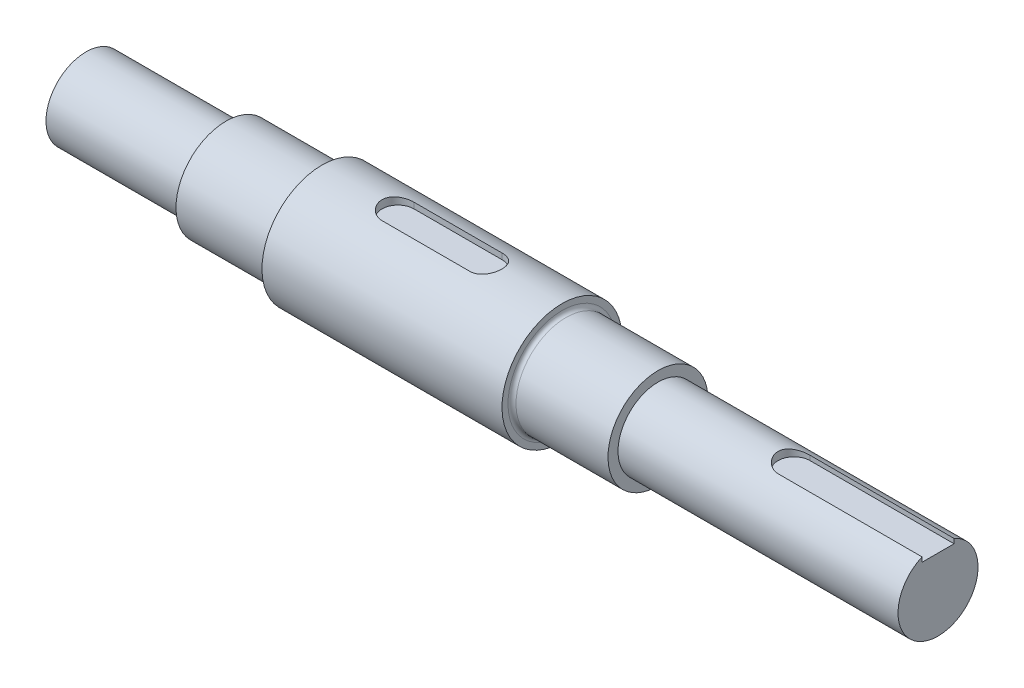
ISO-10303-21;
HEADER;
FILE_DESCRIPTION(('STEP AP214'),'2;1');
FILE_NAME('part.step','',(''),(''),'','','');
FILE_SCHEMA(('AUTOMOTIVE_DESIGN { 1 0 10303 214 1 1 1 1 }'));
ENDSEC;
DATA;
#1=APPLICATION_CONTEXT('core data for automotive mechanical design processes');
#2=APPLICATION_PROTOCOL_DEFINITION('international standard','automotive_design',2000,#1);
#3=PRODUCT_CONTEXT('',#1,'mechanical');
#4=PRODUCT('Part','Part','',(#3));
#5=PRODUCT_RELATED_PRODUCT_CATEGORY('part','',(#4));
#6=PRODUCT_DEFINITION_FORMATION('','',#4);
#7=PRODUCT_DEFINITION_CONTEXT('part definition',#1,'design');
#8=PRODUCT_DEFINITION('design','',#6,#7);
#9=PRODUCT_DEFINITION_SHAPE('','',#8);
#10=(LENGTH_UNIT() NAMED_UNIT(*) SI_UNIT(.MILLI.,.METRE.));
#11=(NAMED_UNIT(*) PLANE_ANGLE_UNIT() SI_UNIT($,.RADIAN.));
#12=(NAMED_UNIT(*) SI_UNIT($,.STERADIAN.) SOLID_ANGLE_UNIT());
#13=UNCERTAINTY_MEASURE_WITH_UNIT(LENGTH_MEASURE(1.E-05),#10,'distance_accuracy_value','');
#14=(GEOMETRIC_REPRESENTATION_CONTEXT(3) GLOBAL_UNCERTAINTY_ASSIGNED_CONTEXT((#13)) GLOBAL_UNIT_ASSIGNED_CONTEXT((#10,
#11,#12)) REPRESENTATION_CONTEXT('',''));
#15=CARTESIAN_POINT('',(0.,0.,0.));
#16=DIRECTION('',(0.,0.,1.));
#17=DIRECTION('',(1.,0.,0.));
#18=AXIS2_PLACEMENT_3D('',#15,#16,#17);
#19=CARTESIAN_POINT('',(-89.,0.,0.));
#20=DIRECTION('',(-1.,0.,0.));
#21=DIRECTION('',(0.,-1.,0.));
#22=AXIS2_PLACEMENT_3D('',#19,#20,#21);
#23=PLANE('',#22);
#24=CARTESIAN_POINT('',(-89.,0.,0.));
#25=DIRECTION('',(1.,0.,0.));
#26=DIRECTION('',(0.,1.,0.));
#27=AXIS2_PLACEMENT_3D('',#24,#25,#26);
#28=CIRCLE('',#27,10.);
#29=CARTESIAN_POINT('',(-89.,10.,0.));
#30=VERTEX_POINT('',#29);
#31=EDGE_CURVE('E184',#30,#30,#28,.T.);
#32=ORIENTED_EDGE('',*,*,#31,.F.);
#33=EDGE_LOOP('',(#32));
#34=FACE_BOUND('',#33,.T.);
#35=ADVANCED_FACE('F38',(#34),#23,.T.);
#36=CARTESIAN_POINT('',(124.,0.,0.));
#37=DIRECTION('',(1.,0.,0.));
#38=DIRECTION('',(0.,1.,0.));
#39=AXIS2_PLACEMENT_3D('',#36,#37,#38);
#40=CYLINDRICAL_SURFACE('',#39,10.);
#41=ORIENTED_EDGE('',*,*,#31,.T.);
#42=EDGE_LOOP('',(#41));
#43=FACE_BOUND('',#42,.T.);
#44=CARTESIAN_POINT('',(-54.,0.,0.));
#45=DIRECTION('',(1.,0.,0.));
#46=DIRECTION('',(0.,1.,0.));
#47=AXIS2_PLACEMENT_3D('',#44,#45,#46);
#48=CIRCLE('',#47,10.);
#49=CARTESIAN_POINT('',(-54.,10.,0.));
#50=VERTEX_POINT('',#49);
#51=EDGE_CURVE('E181',#50,#50,#48,.T.);
#52=ORIENTED_EDGE('',*,*,#51,.F.);
#53=EDGE_LOOP('',(#52));
#54=FACE_BOUND('',#53,.T.);
#55=ADVANCED_FACE('F250',(#43,#54),#40,.T.);
#56=CARTESIAN_POINT('',(-54.,10.,0.));
#57=DIRECTION('',(-1.,0.,0.));
#58=DIRECTION('',(0.,-1.,0.));
#59=AXIS2_PLACEMENT_3D('',#56,#57,#58);
#60=PLANE('',#59);
#61=ORIENTED_EDGE('',*,*,#51,.T.);
#62=EDGE_LOOP('',(#61));
#63=FACE_BOUND('',#62,.T.);
#64=CARTESIAN_POINT('',(-54.,0.,0.));
#65=DIRECTION('',(1.,0.,0.));
#66=DIRECTION('',(0.,1.,0.));
#67=AXIS2_PLACEMENT_3D('',#64,#65,#66);
#68=CIRCLE('',#67,12.5);
#69=CARTESIAN_POINT('',(-54.,12.5,0.));
#70=VERTEX_POINT('',#69);
#71=EDGE_CURVE('E178',#70,#70,#68,.T.);
#72=ORIENTED_EDGE('',*,*,#71,.F.);
#73=EDGE_LOOP('',(#72));
#74=FACE_BOUND('',#73,.T.);
#75=ADVANCED_FACE('F256',(#63,#74),#60,.T.);
#76=CARTESIAN_POINT('',(124.,0.,0.));
#77=DIRECTION('',(1.,0.,0.));
#78=DIRECTION('',(0.,1.,0.));
#79=AXIS2_PLACEMENT_3D('',#76,#77,#78);
#80=CYLINDRICAL_SURFACE('',#79,12.5);
#81=CARTESIAN_POINT('',(-31.,0.,0.));
#82=DIRECTION('',(-1.,0.,0.));
#83=DIRECTION('',(0.,-1.,0.));
#84=AXIS2_PLACEMENT_3D('',#81,#82,#83);
#85=CIRCLE('',#84,12.5);
#86=CARTESIAN_POINT('',(-31.,-12.5,0.));
#87=VERTEX_POINT('',#86);
#88=EDGE_CURVE('E196',#87,#87,#85,.T.);
#89=ORIENTED_EDGE('',*,*,#88,.T.);
#90=EDGE_LOOP('',(#89));
#91=FACE_BOUND('',#90,.T.);
#92=ORIENTED_EDGE('',*,*,#71,.T.);
#93=EDGE_LOOP('',(#92));
#94=FACE_BOUND('',#93,.T.);
#95=ADVANCED_FACE('F306',(#91,#94),#80,.T.);
#96=CARTESIAN_POINT('',(-30.,12.5,0.));
#97=DIRECTION('',(-1.,0.,0.));
#98=DIRECTION('',(0.,-1.,0.));
#99=AXIS2_PLACEMENT_3D('',#96,#97,#98);
#100=PLANE('',#99);
#101=CARTESIAN_POINT('',(-30.,0.,0.));
#102=DIRECTION('',(-1.,0.,0.));
#103=DIRECTION('',(0.,-1.,0.));
#104=AXIS2_PLACEMENT_3D('',#101,#102,#103);
#105=CIRCLE('',#104,13.5);
#106=CARTESIAN_POINT('',(-30.,-13.5,0.));
#107=VERTEX_POINT('',#106);
#108=EDGE_CURVE('E193',#107,#107,#105,.F.);
#109=ORIENTED_EDGE('',*,*,#108,.T.);
#110=EDGE_LOOP('',(#109));
#111=FACE_BOUND('',#110,.T.);
#112=CARTESIAN_POINT('',(-30.,0.,0.));
#113=DIRECTION('',(1.,0.,0.));
#114=DIRECTION('',(0.,1.,0.));
#115=AXIS2_PLACEMENT_3D('',#112,#113,#114);
#116=CIRCLE('',#115,15.);
#117=CARTESIAN_POINT('',(-30.,15.,0.));
#118=VERTEX_POINT('',#117);
#119=EDGE_CURVE('E175',#118,#118,#116,.T.);
#120=ORIENTED_EDGE('',*,*,#119,.F.);
#121=EDGE_LOOP('',(#120));
#122=FACE_BOUND('',#121,.T.);
#123=ADVANCED_FACE('F300',(#111,#122),#100,.T.);
#124=CARTESIAN_POINT('',(124.,0.,0.));
#125=DIRECTION('',(1.,0.,0.));
#126=DIRECTION('',(0.,1.,0.));
#127=AXIS2_PLACEMENT_3D('',#124,#125,#126);
#128=CYLINDRICAL_SURFACE('',#127,15.);
#129=CARTESIAN_POINT('',(-11.,14.456832294801,-4.));
#130=CARTESIAN_POINT('',(-11.1103582434041,14.4568189842467,-4.00001309389174));
#131=CARTESIAN_POINT('',(-11.2207085219929,14.4580956467717,-3.99543311151603));
#132=CARTESIAN_POINT('',(-11.4405786539661,14.4631301353517,-3.97718874589725));
#133=CARTESIAN_POINT('',(-11.5500986577598,14.4668875005959,-3.96352604983923));
#134=CARTESIAN_POINT('',(-11.767301653514,14.4767740441058,-3.92725695741262));
#135=CARTESIAN_POINT('',(-11.8749880878483,14.482898107258,-3.90466984692446));
#136=CARTESIAN_POINT('',(-12.0879748603556,14.4973231400467,-3.85076543838184));
#137=CARTESIAN_POINT('',(-12.1932751565853,14.5056241479174,-3.81944798699437));
#138=CARTESIAN_POINT('',(-12.5044634187753,14.5334412456827,-3.71275643853686));
#139=CARTESIAN_POINT('',(-12.7058749335474,14.5558829598252,-3.62460332607935));
#140=CARTESIAN_POINT('',(-13.0910207596258,14.6060171290377,-3.4169578047582));
#141=CARTESIAN_POINT('',(-13.2747492039724,14.6337113178035,-3.29745504324306));
#142=CARTESIAN_POINT('',(-13.6239705769278,14.6920016406366,-3.0273032087801));
#143=CARTESIAN_POINT('',(-13.7889618409657,14.7226489452442,-2.87601544465618));
#144=CARTESIAN_POINT('',(-14.0915575669616,14.7829523618628,-2.54795832924028));
#145=CARTESIAN_POINT('',(-14.2291575828684,14.8126083123117,-2.37118484921248));
#146=CARTESIAN_POINT('',(-14.4751721301854,14.8681604116921,-1.99367199592156));
#147=CARTESIAN_POINT('',(-14.5830839655783,14.8939887414057,-1.79259414843396));
#148=CARTESIAN_POINT('',(-14.7633728889613,14.9383834129136,-1.3743557555279));
#149=CARTESIAN_POINT('',(-14.8357576447769,14.9569513215518,-1.15719869214847));
#150=CARTESIAN_POINT('',(-14.9413098251693,14.9843709217852,-0.718234307369674));
#151=CARTESIAN_POINT('',(-14.9753372128936,14.9934353394137,-0.496647293428109));
#152=CARTESIAN_POINT('',(-15.005914313223,15.0015705103632,-0.0507319917605784));
#153=CARTESIAN_POINT('',(-15.0024694841925,15.0006427191926,0.173595891963455));
#154=CARTESIAN_POINT('',(-14.9588043136318,14.9890534931376,0.612629502642172));
#155=CARTESIAN_POINT('',(-14.9195138723437,14.9786381919443,0.827435206418326));
#156=CARTESIAN_POINT('',(-14.8067748491367,14.9495347795912,1.24728467665105));
#157=CARTESIAN_POINT('',(-14.7333246478493,14.9308462762364,1.45232797980576));
#158=CARTESIAN_POINT('',(-14.5536400337472,14.8869312076945,1.84920963545355));
#159=CARTESIAN_POINT('',(-14.4470866277702,14.8616414267933,2.04089626466617));
#160=CARTESIAN_POINT('',(-14.2044572310354,14.8072486052897,2.40398441957148));
#161=CARTESIAN_POINT('',(-14.0683760778169,14.7781448982353,2.57538239000351));
#162=CARTESIAN_POINT('',(-13.7656720288986,14.7182294237973,2.8985493503678));
#163=CARTESIAN_POINT('',(-13.5982419921057,14.6873926412643,3.04955722400808));
#164=CARTESIAN_POINT('',(-13.2399571592908,14.6282716207252,3.32161448391783));
#165=CARTESIAN_POINT('',(-13.0490959035188,14.5999880903709,3.4426555807802));
#166=CARTESIAN_POINT('',(-12.7486467166354,14.5618587427771,3.59932937334133));
#167=CARTESIAN_POINT('',(-12.645711084959,14.5498268172621,3.64754371945348));
#168=CARTESIAN_POINT('',(-12.4359536787285,14.5275984074125,3.73509417643326));
#169=CARTESIAN_POINT('',(-12.3291334875373,14.5174011851057,3.77443385857864));
#170=CARTESIAN_POINT('',(-12.1124805807798,14.4991713081511,3.843867838105));
#171=CARTESIAN_POINT('',(-12.002651121807,14.4911364080612,3.87397173088603));
#172=CARTESIAN_POINT('',(-11.780724778875,14.4774747012191,3.92471856960774));
#173=CARTESIAN_POINT('',(-11.66862897718,14.4718467722231,3.9453659249532));
#174=CARTESIAN_POINT('',(-11.463748975282,14.4639761334309,3.97411378733402));
#175=CARTESIAN_POINT('',(-11.3712035538327,14.4613012625133,3.98382319960777));
#176=CARTESIAN_POINT('',(-11.1857746466901,14.4577275048596,3.99676420153356));
#177=CARTESIAN_POINT('',(-11.0928919295675,14.4568258092259,4.00000603663184));
#178=CARTESIAN_POINT('',(-11.,14.456832294801,4.));
#179=B_SPLINE_CURVE_WITH_KNOTS('',3,(#129,#130,#131,#132,#133,#134,#135,#136,#137,#138,#139,
#140,#141,#142,#143,#144,#145,#146,#147,#148,#149,#150,#151,#152,#153,#154,#155,#156,#157,#158,
#159,#160,#161,#162,#163,#164,#165,#166,#167,#168,#169,#170,#171,#172,#173,#174,#175,#176,#177,
#178),.UNSPECIFIED.,.F.,.F.,(4,2,2,2,2,2,2,2,2,2,2,2,2,2,2,2,2,2,2,2,2,2,2,2,4),(0.,
0.330958670878053,0.661855880768517,0.992041890688582,1.32223370010825,1.98190700187181,
2.64179842357631,3.31649637536149,3.99130375261118,4.67691814590523,5.3623844975935,
6.03215661862343,6.70183117906689,7.35461236515045,8.00742449996358,8.66673340793703,
9.32615767867957,10.0057598785669,10.6855498604333,11.0281077435251,11.3705275300852,
11.7125903499581,12.0544935096114,12.3335333037377,12.6121307120356),.UNSPECIFIED.);
#180=CARTESIAN_POINT('',(-11.,14.456832294801,-4.));
#181=VERTEX_POINT('',#180);
#182=CARTESIAN_POINT('',(-11.,14.456832294801,4.));
#183=VERTEX_POINT('',#182);
#184=EDGE_CURVE('E199',#181,#183,#179,.T.);
#185=ORIENTED_EDGE('',*,*,#184,.F.);
#186=DIRECTION('',(1.,0.,0.));
#187=VECTOR('',#186,1.);
#188=CARTESIAN_POINT('',(124.,14.456832294801,-4.00000000000001));
#189=LINE('',#188,#187);
#190=CARTESIAN_POINT('',(11.,14.456832294801,-4.));
#191=VERTEX_POINT('',#190);
#192=EDGE_CURVE('E52',#191,#181,#189,.F.);
#193=ORIENTED_EDGE('',*,*,#192,.F.);
#194=CARTESIAN_POINT('',(11.,14.456832294801,4.));
#195=CARTESIAN_POINT('',(11.1103582434041,14.4568189842467,4.00001309389174));
#196=CARTESIAN_POINT('',(11.2207085219929,14.4580956467717,3.99543311151603));
#197=CARTESIAN_POINT('',(11.4405786539661,14.4631301353517,3.97718874589725));
#198=CARTESIAN_POINT('',(11.5500986577598,14.4668875005959,3.96352604983923));
#199=CARTESIAN_POINT('',(11.767301653514,14.4767740441058,3.92725695741262));
#200=CARTESIAN_POINT('',(11.8749880878483,14.482898107258,3.90466984692446));
#201=CARTESIAN_POINT('',(12.0879748603556,14.4973231400467,3.85076543838184));
#202=CARTESIAN_POINT('',(12.1932751565853,14.5056241479174,3.81944798699437));
#203=CARTESIAN_POINT('',(12.5044634187753,14.5334412456827,3.71275643853686));
#204=CARTESIAN_POINT('',(12.7058749335474,14.5558829598252,3.62460332607935));
#205=CARTESIAN_POINT('',(13.0910207596258,14.6060171290377,3.4169578047582));
#206=CARTESIAN_POINT('',(13.2747492039724,14.6337113178035,3.29745504324306));
#207=CARTESIAN_POINT('',(13.6239705769278,14.6920016406366,3.02730320878009));
#208=CARTESIAN_POINT('',(13.7889618409657,14.7226489452442,2.87601544465618));
#209=CARTESIAN_POINT('',(14.0915575669616,14.7829523618628,2.54795832924028));
#210=CARTESIAN_POINT('',(14.2291575828684,14.8126083123117,2.37118484921248));
#211=CARTESIAN_POINT('',(14.4751721301854,14.8681604116921,1.99367199592155));
#212=CARTESIAN_POINT('',(14.5830839655783,14.8939887414057,1.79259414843396));
#213=CARTESIAN_POINT('',(14.7633728889613,14.9383834129136,1.3743557555279));
#214=CARTESIAN_POINT('',(14.8357576447769,14.9569513215518,1.15719869214846));
#215=CARTESIAN_POINT('',(14.9413098251693,14.9843709217852,0.718234307369669));
#216=CARTESIAN_POINT('',(14.9753372128936,14.9934353394137,0.496647293428104));
#217=CARTESIAN_POINT('',(15.005914313223,15.0015705103632,0.0507319917605739));
#218=CARTESIAN_POINT('',(15.0024694841925,15.0006427191926,-0.173595891963459));
#219=CARTESIAN_POINT('',(14.9588043136318,14.9890534931376,-0.612629502642176));
#220=CARTESIAN_POINT('',(14.9195138723437,14.9786381919443,-0.82743520641833));
#221=CARTESIAN_POINT('',(14.8067748491367,14.9495347795913,-1.24728467665105));
#222=CARTESIAN_POINT('',(14.7333246478493,14.9308462762364,-1.45232797980576));
#223=CARTESIAN_POINT('',(14.5536400337472,14.8869312076945,-1.84920963545356));
#224=CARTESIAN_POINT('',(14.4470866277702,14.8616414267933,-2.04089626466617));
#225=CARTESIAN_POINT('',(14.2044572310354,14.8072486052897,-2.40398441957148));
#226=CARTESIAN_POINT('',(14.0683760778169,14.7781448982353,-2.57538239000351));
#227=CARTESIAN_POINT('',(13.7656720288986,14.7182294237973,-2.89854935036781));
#228=CARTESIAN_POINT('',(13.5982419921057,14.6873926412643,-3.04955722400809));
#229=CARTESIAN_POINT('',(13.2399571592908,14.6282716207252,-3.32161448391783));
#230=CARTESIAN_POINT('',(13.0490959035188,14.5999880903709,-3.4426555807802));
#231=CARTESIAN_POINT('',(12.7486467166354,14.5618587427771,-3.59932937334134));
#232=CARTESIAN_POINT('',(12.645711084959,14.5498268172621,-3.64754371945348));
#233=CARTESIAN_POINT('',(12.4359536787285,14.5275984074125,-3.73509417643327));
#234=CARTESIAN_POINT('',(12.3291334875372,14.5174011851057,-3.77443385857864));
#235=CARTESIAN_POINT('',(12.1124805807798,14.4991713081511,-3.843867838105));
#236=CARTESIAN_POINT('',(12.002651121807,14.4911364080612,-3.87397173088604));
#237=CARTESIAN_POINT('',(11.780724778875,14.4774747012191,-3.92471856960775));
#238=CARTESIAN_POINT('',(11.66862897718,14.4718467722231,-3.9453659249532));
#239=CARTESIAN_POINT('',(11.463748975282,14.4639761334309,-3.97411378733403));
#240=CARTESIAN_POINT('',(11.3712035538327,14.4613012625133,-3.98382319960777));
#241=CARTESIAN_POINT('',(11.1857746466901,14.4577275048596,-3.99676420153356));
#242=CARTESIAN_POINT('',(11.0928919295675,14.4568258092259,-4.00000603663184));
#243=CARTESIAN_POINT('',(11.,14.456832294801,-4.));
#244=B_SPLINE_CURVE_WITH_KNOTS('',3,(#194,#195,#196,#197,#198,#199,#200,#201,#202,#203,#204,
#205,#206,#207,#208,#209,#210,#211,#212,#213,#214,#215,#216,#217,#218,#219,#220,#221,#222,#223,
#224,#225,#226,#227,#228,#229,#230,#231,#232,#233,#234,#235,#236,#237,#238,#239,#240,#241,#242,
#243),.UNSPECIFIED.,.F.,.F.,(4,2,2,2,2,2,2,2,2,2,2,2,2,2,2,2,2,2,2,2,2,2,2,2,4),(0.,
0.330958670878053,0.661855880768517,0.992041890688582,1.32223370010825,1.98190700187181,
2.64179842357631,3.3164963753615,3.99130375261119,4.67691814590524,5.36238449759351,
6.03215661862343,6.7018311790669,7.35461236515045,8.00742449996358,8.66673340793703,
9.32615767867957,10.0057598785669,10.6855498604333,11.0281077435251,11.3705275300852,
11.7125903499582,12.0544935096114,12.3335333037377,12.6121307120356),.UNSPECIFIED.);
#245=CARTESIAN_POINT('',(11.,14.456832294801,4.));
#246=VERTEX_POINT('',#245);
#247=EDGE_CURVE('E231',#246,#191,#244,.T.);
#248=ORIENTED_EDGE('',*,*,#247,.F.);
#249=DIRECTION('',(1.,0.,0.));
#250=VECTOR('',#249,1.);
#251=CARTESIAN_POINT('',(124.,14.456832294801,3.99999999999999));
#252=LINE('',#251,#250);
#253=EDGE_CURVE('E207',#183,#246,#252,.T.);
#254=ORIENTED_EDGE('',*,*,#253,.F.);
#255=EDGE_LOOP('',(#185,#193,#248,#254));
#256=FACE_BOUND('',#255,.T.);
#257=ORIENTED_EDGE('',*,*,#119,.T.);
#258=EDGE_LOOP('',(#257));
#259=FACE_BOUND('',#258,.T.);
#260=CARTESIAN_POINT('',(30.,0.,0.));
#261=DIRECTION('',(1.,0.,0.));
#262=DIRECTION('',(0.,1.,0.));
#263=AXIS2_PLACEMENT_3D('',#260,#261,#262);
#264=CIRCLE('',#263,15.);
#265=CARTESIAN_POINT('',(30.,15.,0.));
#266=VERTEX_POINT('',#265);
#267=EDGE_CURVE('E172',#266,#266,#264,.T.);
#268=ORIENTED_EDGE('',*,*,#267,.F.);
#269=EDGE_LOOP('',(#268));
#270=FACE_BOUND('',#269,.T.);
#271=ADVANCED_FACE('F209',(#256,#259,#270),#128,.T.);
#272=CARTESIAN_POINT('',(30.,12.5,0.));
#273=DIRECTION('',(1.,0.,0.));
#274=DIRECTION('',(0.,1.,0.));
#275=AXIS2_PLACEMENT_3D('',#272,#273,#274);
#276=PLANE('',#275);
#277=CARTESIAN_POINT('',(30.,0.,0.));
#278=DIRECTION('',(1.,0.,0.));
#279=DIRECTION('',(0.,1.,0.));
#280=AXIS2_PLACEMENT_3D('',#277,#278,#279);
#281=CIRCLE('',#280,13.5);
#282=CARTESIAN_POINT('',(30.,13.5,0.));
#283=VERTEX_POINT('',#282);
#284=EDGE_CURVE('E190',#283,#283,#281,.F.);
#285=ORIENTED_EDGE('',*,*,#284,.T.);
#286=EDGE_LOOP('',(#285));
#287=FACE_BOUND('',#286,.T.);
#288=ORIENTED_EDGE('',*,*,#267,.T.);
#289=EDGE_LOOP('',(#288));
#290=FACE_BOUND('',#289,.T.);
#291=ADVANCED_FACE('F279',(#287,#290),#276,.T.);
#292=CARTESIAN_POINT('',(124.,0.,0.));
#293=DIRECTION('',(1.,0.,0.));
#294=DIRECTION('',(0.,1.,0.));
#295=AXIS2_PLACEMENT_3D('',#292,#293,#294);
#296=CYLINDRICAL_SURFACE('',#295,12.5);
#297=CARTESIAN_POINT('',(31.,0.,0.));
#298=DIRECTION('',(1.,0.,0.));
#299=DIRECTION('',(0.,1.,0.));
#300=AXIS2_PLACEMENT_3D('',#297,#298,#299);
#301=CIRCLE('',#300,12.5);
#302=CARTESIAN_POINT('',(31.,12.5,0.));
#303=VERTEX_POINT('',#302);
#304=EDGE_CURVE('E187',#303,#303,#301,.T.);
#305=ORIENTED_EDGE('',*,*,#304,.T.);
#306=EDGE_LOOP('',(#305));
#307=FACE_BOUND('',#306,.T.);
#308=CARTESIAN_POINT('',(54.,0.,0.));
#309=DIRECTION('',(1.,0.,0.));
#310=DIRECTION('',(0.,1.,0.));
#311=AXIS2_PLACEMENT_3D('',#308,#309,#310);
#312=CIRCLE('',#311,12.5);
#313=CARTESIAN_POINT('',(54.,12.5,0.));
#314=VERTEX_POINT('',#313);
#315=EDGE_CURVE('E169',#314,#314,#312,.T.);
#316=ORIENTED_EDGE('',*,*,#315,.F.);
#317=EDGE_LOOP('',(#316));
#318=FACE_BOUND('',#317,.T.);
#319=ADVANCED_FACE('F276',(#307,#318),#296,.T.);
#320=CARTESIAN_POINT('',(54.,10.,0.));
#321=DIRECTION('',(1.,0.,0.));
#322=DIRECTION('',(0.,1.,0.));
#323=AXIS2_PLACEMENT_3D('',#320,#321,#322);
#324=PLANE('',#323);
#325=ORIENTED_EDGE('',*,*,#315,.T.);
#326=EDGE_LOOP('',(#325));
#327=FACE_BOUND('',#326,.T.);
#328=CARTESIAN_POINT('',(54.,0.,0.));
#329=DIRECTION('',(1.,0.,0.));
#330=DIRECTION('',(0.,1.,0.));
#331=AXIS2_PLACEMENT_3D('',#328,#329,#330);
#332=CIRCLE('',#331,10.);
#333=CARTESIAN_POINT('',(54.,10.,0.));
#334=VERTEX_POINT('',#333);
#335=EDGE_CURVE('E166',#334,#334,#332,.T.);
#336=ORIENTED_EDGE('',*,*,#335,.F.);
#337=EDGE_LOOP('',(#336));
#338=FACE_BOUND('',#337,.T.);
#339=ADVANCED_FACE('F278',(#327,#338),#324,.T.);
#340=CARTESIAN_POINT('',(124.,0.,0.));
#341=DIRECTION('',(1.,0.,0.));
#342=DIRECTION('',(0.,1.,0.));
#343=AXIS2_PLACEMENT_3D('',#340,#341,#342);
#344=CYLINDRICAL_SURFACE('',#343,10.);
#345=CARTESIAN_POINT('',(88.,9.16515138991169,-4.));
#346=CARTESIAN_POINT('',(87.8923882949459,9.16512928809545,-4.00001596071937));
#347=CARTESIAN_POINT('',(87.7847886688333,9.1670461201143,-3.99565782731266));
#348=CARTESIAN_POINT('',(87.5704574034613,9.17459250745479,-3.9783181194646));
#349=CARTESIAN_POINT('',(87.4637254492831,9.18022064873059,-3.96533982937531));
#350=CARTESIAN_POINT('',(87.2523063568937,9.19499565865172,-3.93095207352899));
#351=CARTESIAN_POINT('',(87.147612831915,9.20412861441612,-3.90957593640916));
#352=CARTESIAN_POINT('',(86.9405984565681,9.22560106586819,-3.85863260381273));
#353=CARTESIAN_POINT('',(86.8382777514449,9.23794075728509,-3.82906490834148));
#354=CARTESIAN_POINT('',(86.5361282988375,9.27918582501411,-3.72853943587112));
#355=CARTESIAN_POINT('',(86.3406915386172,9.31234898316151,-3.64568978920222));
#356=CARTESIAN_POINT('',(85.9664088398381,9.3862474152947,-3.45096383184147));
#357=CARTESIAN_POINT('',(85.7875788940915,9.42698987727426,-3.33905992673094));
#358=CARTESIAN_POINT('',(85.4414752066361,9.51401998804847,-3.08263671474507));
#359=CARTESIAN_POINT('',(85.2752655660996,9.56048491272145,-2.93673827988501));
#360=CARTESIAN_POINT('',(84.9689194556385,9.652255810962,-2.61939292349378));
#361=CARTESIAN_POINT('',(84.8287883384928,9.69756154495613,-2.44794076987999));
#362=CARTESIAN_POINT('',(84.5731872113756,9.78406834216145,-2.07601181629754));
#363=CARTESIAN_POINT('',(84.4589103805899,9.82503649102096,-1.87465586655103));
#364=CARTESIAN_POINT('',(84.2663118555087,9.8960788823498,-1.45364828604453));
#365=CARTESIAN_POINT('',(84.1879751552067,9.92615767032248,-1.23400433637532));
#366=CARTESIAN_POINT('',(84.0733175942291,9.97076629361037,-0.79393488418738));
#367=CARTESIAN_POINT('',(84.0351460866969,9.98597845290695,-0.574062114869032));
#368=CARTESIAN_POINT('',(83.9959430515965,10.001606202074,-0.130536855092214));
#369=CARTESIAN_POINT('',(83.9948983667483,10.0020270338048,0.0931142682526709));
#370=CARTESIAN_POINT('',(84.0289656379283,9.98843920775429,0.524466731987224));
#371=CARTESIAN_POINT('',(84.0620499465532,9.97523973659778,0.732358330632743));
#372=CARTESIAN_POINT('',(84.1599870009102,9.93698538393898,1.13934964738688));
#373=CARTESIAN_POINT('',(84.2248415445704,9.91192983148496,1.33844886722558));
#374=CARTESIAN_POINT('',(84.385272037772,9.85193670608707,1.72579479688348));
#375=CARTESIAN_POINT('',(84.4812963958391,9.81685584875392,1.91383264586891));
#376=CARTESIAN_POINT('',(84.7009312637048,9.7402916863997,2.2716159956307));
#377=CARTESIAN_POINT('',(84.8245514514379,9.69880613681325,2.44135504792269));
#378=CARTESIAN_POINT('',(85.1052800574365,9.61043706268123,2.7695225783069));
#379=CARTESIAN_POINT('',(85.2640530171164,9.5633779574542,2.92647922614483));
#380=CARTESIAN_POINT('',(85.6059921366628,9.47123359153047,3.2122147086262));
#381=CARTESIAN_POINT('',(85.7891693487996,9.42614923753062,3.34098070594789));
#382=CARTESIAN_POINT('',(86.0816356456234,9.36326134539256,3.51186134851388));
#383=CARTESIAN_POINT('',(86.1836718383149,9.34283170142196,3.56571263251514));
#384=CARTESIAN_POINT('',(86.3923923024092,9.30450957703986,3.66454761505658));
#385=CARTESIAN_POINT('',(86.4990745457273,9.28661600381595,3.70953513634085));
#386=CARTESIAN_POINT('',(86.7162289304963,9.25400250539922,3.79016254319007));
#387=CARTESIAN_POINT('',(86.8266961700414,9.23927864276952,3.82581403809398));
#388=CARTESIAN_POINT('',(87.0506683681487,9.21351467730912,3.88744848158463));
#389=CARTESIAN_POINT('',(87.1641719402126,9.20247292309663,3.91343576505911));
#390=CARTESIAN_POINT('',(87.3974454473375,9.18417798205496,3.95619393609845));
#391=CARTESIAN_POINT('',(87.5172941945638,9.17707470750588,3.97260125584169));
#392=CARTESIAN_POINT('',(87.7580909291371,9.16754485606459,3.99451448409731));
#393=CARTESIAN_POINT('',(87.8790381929227,9.16511539745839,4.00002710996009));
#394=CARTESIAN_POINT('',(88.,9.1651513899117,3.99999999999999));
#395=B_SPLINE_CURVE_WITH_KNOTS('',3,(#345,#346,#347,#348,#349,#350,#351,#352,#353,#354,#355,
#356,#357,#358,#359,#360,#361,#362,#363,#364,#365,#366,#367,#368,#369,#370,#371,#372,#373,#374,
#375,#376,#377,#378,#379,#380,#381,#382,#383,#384,#385,#386,#387,#388,#389,#390,#391,#392,#393,
#394),.UNSPECIFIED.,.F.,.F.,(4,2,2,2,2,2,2,2,2,2,2,2,2,2,2,2,2,2,2,2,2,2,2,2,4),(0.,
0.322709706217834,0.645296527806424,0.966615822543774,1.28795473422461,1.92936600351818,
2.5713886988925,3.24636095994994,3.92147161082381,4.62325717855526,5.32474946398644,
5.99227753012539,6.65956903033311,7.28937830523069,7.91922322615308,8.55856353859092,
9.19812842270037,9.87963749353245,10.5614562641081,10.9125878460839,11.2635676597187,
11.6141089352909,11.964492785171,12.3274303244848,12.6901440171997),.UNSPECIFIED.);
#396=CARTESIAN_POINT('',(88.,9.16515138991169,-4.));
#397=VERTEX_POINT('',#396);
#398=CARTESIAN_POINT('',(88.,9.16515138991169,4.));
#399=VERTEX_POINT('',#398);
#400=EDGE_CURVE('E11',#397,#399,#395,.T.);
#401=ORIENTED_EDGE('',*,*,#400,.F.);
#402=DIRECTION('',(1.,0.,0.));
#403=VECTOR('',#402,1.);
#404=CARTESIAN_POINT('',(124.,9.1651513899117,-4.));
#405=LINE('',#404,#403);
#406=CARTESIAN_POINT('',(124.,9.16515138991168,-4.));
#407=VERTEX_POINT('',#406);
#408=EDGE_CURVE('E138',#407,#397,#405,.F.);
#409=ORIENTED_EDGE('',*,*,#408,.F.);
#410=CARTESIAN_POINT('',(124.,0.,0.));
#411=DIRECTION('',(1.,0.,0.));
#412=DIRECTION('',(0.,1.,0.));
#413=AXIS2_PLACEMENT_3D('',#410,#411,#412);
#414=CIRCLE('',#413,10.);
#415=CARTESIAN_POINT('',(124.,9.16515138991168,4.));
#416=VERTEX_POINT('',#415);
#417=EDGE_CURVE('E156',#416,#407,#414,.T.);
#418=ORIENTED_EDGE('',*,*,#417,.F.);
#419=DIRECTION('',(1.,0.,0.));
#420=VECTOR('',#419,1.);
#421=CARTESIAN_POINT('',(124.,9.1651513899117,4.));
#422=LINE('',#421,#420);
#423=EDGE_CURVE('E133',#399,#416,#422,.T.);
#424=ORIENTED_EDGE('',*,*,#423,.F.);
#425=EDGE_LOOP('',(#401,#409,#418,#424));
#426=FACE_BOUND('',#425,.T.);
#427=ORIENTED_EDGE('',*,*,#335,.T.);
#428=EDGE_LOOP('',(#427));
#429=FACE_BOUND('',#428,.T.);
#430=ADVANCED_FACE('F270',(#426,#429),#344,.T.);
#431=CARTESIAN_POINT('',(124.,10.,0.));
#432=DIRECTION('',(1.,0.,0.));
#433=DIRECTION('',(0.,1.,0.));
#434=AXIS2_PLACEMENT_3D('',#431,#432,#433);
#435=PLANE('',#434);
#436=DIRECTION('',(0.,1.,0.));
#437=VECTOR('',#436,1.);
#438=CARTESIAN_POINT('',(124.,8.,-4.));
#439=LINE('',#438,#437);
#440=CARTESIAN_POINT('',(124.,8.,-4.));
#441=VERTEX_POINT('',#440);
#442=EDGE_CURVE('E134',#441,#407,#439,.T.);
#443=ORIENTED_EDGE('',*,*,#442,.F.);
#444=DIRECTION('',(0.,0.,-1.));
#445=VECTOR('',#444,1.);
#446=CARTESIAN_POINT('',(124.,8.,-4.));
#447=LINE('',#446,#445);
#448=CARTESIAN_POINT('',(124.,8.,4.));
#449=VERTEX_POINT('',#448);
#450=EDGE_CURVE('E123',#449,#441,#447,.T.);
#451=ORIENTED_EDGE('',*,*,#450,.F.);
#452=DIRECTION('',(0.,1.,0.));
#453=VECTOR('',#452,1.);
#454=CARTESIAN_POINT('',(124.,8.,4.));
#455=LINE('',#454,#453);
#456=EDGE_CURVE('E117',#449,#416,#455,.T.);
#457=ORIENTED_EDGE('',*,*,#456,.T.);
#458=ORIENTED_EDGE('',*,*,#417,.T.);
#459=EDGE_LOOP('',(#443,#451,#457,#458));
#460=FACE_BOUND('',#459,.T.);
#461=ADVANCED_FACE('F230',(#460),#435,.T.);
#462=CARTESIAN_POINT('',(31.,0.,0.));
#463=DIRECTION('',(1.,0.,0.));
#464=DIRECTION('',(0.,1.,0.));
#465=AXIS2_PLACEMENT_3D('',#462,#463,#464);
#466=TOROIDAL_SURFACE('',#465,13.5,1.);
#467=ORIENTED_EDGE('',*,*,#284,.F.);
#468=EDGE_LOOP('',(#467));
#469=FACE_BOUND('',#468,.T.);
#470=ORIENTED_EDGE('',*,*,#304,.F.);
#471=EDGE_LOOP('',(#470));
#472=FACE_BOUND('',#471,.T.);
#473=ADVANCED_FACE('F261',(#469,#472),#466,.F.);
#474=CARTESIAN_POINT('',(-31.,0.,0.));
#475=DIRECTION('',(-1.,0.,0.));
#476=DIRECTION('',(0.,-1.,0.));
#477=AXIS2_PLACEMENT_3D('',#474,#475,#476);
#478=TOROIDAL_SURFACE('',#477,13.5,1.);
#479=ORIENTED_EDGE('',*,*,#88,.F.);
#480=EDGE_LOOP('',(#479));
#481=FACE_BOUND('',#480,.T.);
#482=ORIENTED_EDGE('',*,*,#108,.F.);
#483=EDGE_LOOP('',(#482));
#484=FACE_BOUND('',#483,.T.);
#485=ADVANCED_FACE('F40',(#481,#484),#478,.F.);
#486=CARTESIAN_POINT('',(11.,13.,0.));
#487=DIRECTION('',(0.,1.,0.));
#488=DIRECTION('',(0.,0.,1.));
#489=AXIS2_PLACEMENT_3D('',#486,#487,#488);
#490=CYLINDRICAL_SURFACE('',#489,4.);
#491=DIRECTION('',(0.,1.,0.));
#492=VECTOR('',#491,1.);
#493=CARTESIAN_POINT('',(11.,13.,4.));
#494=LINE('',#493,#492);
#495=CARTESIAN_POINT('',(11.,13.,4.));
#496=VERTEX_POINT('',#495);
#497=EDGE_CURVE('E153',#496,#246,#494,.T.);
#498=ORIENTED_EDGE('',*,*,#497,.T.);
#499=ORIENTED_EDGE('',*,*,#247,.T.);
#500=DIRECTION('',(0.,1.,0.));
#501=VECTOR('',#500,1.);
#502=CARTESIAN_POINT('',(11.,13.,-4.));
#503=LINE('',#502,#501);
#504=CARTESIAN_POINT('',(11.,13.,-4.));
#505=VERTEX_POINT('',#504);
#506=EDGE_CURVE('E67',#505,#191,#503,.T.);
#507=ORIENTED_EDGE('',*,*,#506,.F.);
#508=CARTESIAN_POINT('',(11.,13.,0.));
#509=DIRECTION('',(0.,1.,0.));
#510=DIRECTION('',(0.,0.,1.));
#511=AXIS2_PLACEMENT_3D('',#508,#509,#510);
#512=CIRCLE('',#511,4.);
#513=EDGE_CURVE('E141',#496,#505,#512,.T.);
#514=ORIENTED_EDGE('',*,*,#513,.F.);
#515=EDGE_LOOP('',(#498,#499,#507,#514));
#516=FACE_BOUND('',#515,.T.);
#517=ADVANCED_FACE('F225',(#516),#490,.F.);
#518=CARTESIAN_POINT('',(11.,13.,4.));
#519=DIRECTION('',(0.,0.,1.));
#520=DIRECTION('',(1.,0.,0.));
#521=AXIS2_PLACEMENT_3D('',#518,#519,#520);
#522=PLANE('',#521);
#523=ORIENTED_EDGE('',*,*,#253,.T.);
#524=ORIENTED_EDGE('',*,*,#497,.F.);
#525=DIRECTION('',(1.,0.,0.));
#526=VECTOR('',#525,1.);
#527=CARTESIAN_POINT('',(11.,13.,4.));
#528=LINE('',#527,#526);
#529=CARTESIAN_POINT('',(-11.,13.,4.));
#530=VERTEX_POINT('',#529);
#531=EDGE_CURVE('E150',#530,#496,#528,.T.);
#532=ORIENTED_EDGE('',*,*,#531,.F.);
#533=DIRECTION('',(0.,1.,0.));
#534=VECTOR('',#533,1.);
#535=CARTESIAN_POINT('',(-11.,13.,4.));
#536=LINE('',#535,#534);
#537=EDGE_CURVE('E157',#530,#183,#536,.T.);
#538=ORIENTED_EDGE('',*,*,#537,.T.);
#539=EDGE_LOOP('',(#523,#524,#532,#538));
#540=FACE_BOUND('',#539,.T.);
#541=ADVANCED_FACE('F219',(#540),#522,.F.);
#542=CARTESIAN_POINT('',(-11.,13.,0.));
#543=DIRECTION('',(0.,1.,0.));
#544=DIRECTION('',(0.,0.,1.));
#545=AXIS2_PLACEMENT_3D('',#542,#543,#544);
#546=CYLINDRICAL_SURFACE('',#545,4.);
#547=DIRECTION('',(0.,1.,0.));
#548=VECTOR('',#547,1.);
#549=CARTESIAN_POINT('',(-11.,13.,-4.));
#550=LINE('',#549,#548);
#551=CARTESIAN_POINT('',(-11.,13.,-4.));
#552=VERTEX_POINT('',#551);
#553=EDGE_CURVE('E160',#552,#181,#550,.T.);
#554=ORIENTED_EDGE('',*,*,#553,.T.);
#555=ORIENTED_EDGE('',*,*,#184,.T.);
#556=ORIENTED_EDGE('',*,*,#537,.F.);
#557=CARTESIAN_POINT('',(-11.,13.,0.));
#558=DIRECTION('',(0.,1.,0.));
#559=DIRECTION('',(0.,0.,1.));
#560=AXIS2_PLACEMENT_3D('',#557,#558,#559);
#561=CIRCLE('',#560,4.);
#562=EDGE_CURVE('E147',#552,#530,#561,.T.);
#563=ORIENTED_EDGE('',*,*,#562,.F.);
#564=EDGE_LOOP('',(#554,#555,#556,#563));
#565=FACE_BOUND('',#564,.T.);
#566=ADVANCED_FACE('F213',(#565),#546,.F.);
#567=CARTESIAN_POINT('',(11.,13.,-4.));
#568=DIRECTION('',(0.,0.,-1.));
#569=DIRECTION('',(-1.,0.,0.));
#570=AXIS2_PLACEMENT_3D('',#567,#568,#569);
#571=PLANE('',#570);
#572=ORIENTED_EDGE('',*,*,#192,.T.);
#573=ORIENTED_EDGE('',*,*,#553,.F.);
#574=DIRECTION('',(-1.,0.,0.));
#575=VECTOR('',#574,1.);
#576=CARTESIAN_POINT('',(11.,13.,-4.));
#577=LINE('',#576,#575);
#578=EDGE_CURVE('E144',#505,#552,#577,.T.);
#579=ORIENTED_EDGE('',*,*,#578,.F.);
#580=ORIENTED_EDGE('',*,*,#506,.T.);
#581=EDGE_LOOP('',(#572,#573,#579,#580));
#582=FACE_BOUND('',#581,.T.);
#583=ADVANCED_FACE('F218',(#582),#571,.F.);
#584=CARTESIAN_POINT('',(11.,13.,0.));
#585=DIRECTION('',(0.,1.,0.));
#586=DIRECTION('',(0.,0.,1.));
#587=AXIS2_PLACEMENT_3D('',#584,#585,#586);
#588=PLANE('',#587);
#589=ORIENTED_EDGE('',*,*,#513,.T.);
#590=ORIENTED_EDGE('',*,*,#578,.T.);
#591=ORIENTED_EDGE('',*,*,#562,.T.);
#592=ORIENTED_EDGE('',*,*,#531,.T.);
#593=EDGE_LOOP('',(#589,#590,#591,#592));
#594=FACE_BOUND('',#593,.T.);
#595=ADVANCED_FACE('F224',(#594),#588,.T.);
#596=CARTESIAN_POINT('',(88.,8.,0.));
#597=DIRECTION('',(0.,1.,0.));
#598=DIRECTION('',(0.,0.,1.));
#599=AXIS2_PLACEMENT_3D('',#596,#597,#598);
#600=CYLINDRICAL_SURFACE('',#599,4.);
#601=DIRECTION('',(0.,1.,0.));
#602=VECTOR('',#601,1.);
#603=CARTESIAN_POINT('',(88.,8.,-4.));
#604=LINE('',#603,#602);
#605=CARTESIAN_POINT('',(88.,8.,-4.));
#606=VERTEX_POINT('',#605);
#607=EDGE_CURVE('E131',#606,#397,#604,.T.);
#608=ORIENTED_EDGE('',*,*,#607,.T.);
#609=ORIENTED_EDGE('',*,*,#400,.T.);
#610=DIRECTION('',(0.,1.,0.));
#611=VECTOR('',#610,1.);
#612=CARTESIAN_POINT('',(88.,8.,4.));
#613=LINE('',#612,#611);
#614=CARTESIAN_POINT('',(88.,8.,4.));
#615=VERTEX_POINT('',#614);
#616=EDGE_CURVE('E110',#615,#399,#613,.T.);
#617=ORIENTED_EDGE('',*,*,#616,.F.);
#618=CARTESIAN_POINT('',(88.,8.,0.));
#619=DIRECTION('',(0.,1.,0.));
#620=DIRECTION('',(0.,0.,1.));
#621=AXIS2_PLACEMENT_3D('',#618,#619,#620);
#622=CIRCLE('',#621,4.);
#623=EDGE_CURVE('E113',#606,#615,#622,.T.);
#624=ORIENTED_EDGE('',*,*,#623,.F.);
#625=EDGE_LOOP('',(#608,#609,#617,#624));
#626=FACE_BOUND('',#625,.T.);
#627=ADVANCED_FACE('F112',(#626),#600,.F.);
#628=CARTESIAN_POINT('',(124.,8.,-4.));
#629=DIRECTION('',(0.,0.,-1.));
#630=DIRECTION('',(-1.,0.,0.));
#631=AXIS2_PLACEMENT_3D('',#628,#629,#630);
#632=PLANE('',#631);
#633=ORIENTED_EDGE('',*,*,#408,.T.);
#634=ORIENTED_EDGE('',*,*,#607,.F.);
#635=DIRECTION('',(-1.,0.,0.));
#636=VECTOR('',#635,1.);
#637=CARTESIAN_POINT('',(124.,8.,-4.));
#638=LINE('',#637,#636);
#639=EDGE_CURVE('E118',#441,#606,#638,.T.);
#640=ORIENTED_EDGE('',*,*,#639,.F.);
#641=ORIENTED_EDGE('',*,*,#442,.T.);
#642=EDGE_LOOP('',(#633,#634,#640,#641));
#643=FACE_BOUND('',#642,.T.);
#644=ADVANCED_FACE('F406',(#643),#632,.F.);
#645=CARTESIAN_POINT('',(124.,8.,4.));
#646=DIRECTION('',(0.,0.,1.));
#647=DIRECTION('',(1.,0.,0.));
#648=AXIS2_PLACEMENT_3D('',#645,#646,#647);
#649=PLANE('',#648);
#650=ORIENTED_EDGE('',*,*,#423,.T.);
#651=ORIENTED_EDGE('',*,*,#456,.F.);
#652=DIRECTION('',(1.,0.,0.));
#653=VECTOR('',#652,1.);
#654=CARTESIAN_POINT('',(124.,8.,4.));
#655=LINE('',#654,#653);
#656=EDGE_CURVE('E59',#615,#449,#655,.T.);
#657=ORIENTED_EDGE('',*,*,#656,.F.);
#658=ORIENTED_EDGE('',*,*,#616,.T.);
#659=EDGE_LOOP('',(#650,#651,#657,#658));
#660=FACE_BOUND('',#659,.T.);
#661=ADVANCED_FACE('F120',(#660),#649,.F.);
#662=CARTESIAN_POINT('',(88.,8.,0.));
#663=DIRECTION('',(0.,1.,0.));
#664=DIRECTION('',(0.,0.,1.));
#665=AXIS2_PLACEMENT_3D('',#662,#663,#664);
#666=PLANE('',#665);
#667=ORIENTED_EDGE('',*,*,#623,.T.);
#668=ORIENTED_EDGE('',*,*,#656,.T.);
#669=ORIENTED_EDGE('',*,*,#450,.T.);
#670=ORIENTED_EDGE('',*,*,#639,.T.);
#671=EDGE_LOOP('',(#667,#668,#669,#670));
#672=FACE_BOUND('',#671,.T.);
#673=ADVANCED_FACE('F125',(#672),#666,.T.);
#674=CLOSED_SHELL('',(#35,#55,#75,#95,#123,#271,#291,#319,#339,#430,#461,#473,#485,#517,#541,
#566,#583,#595,#627,#644,#661,#673));
#675=MANIFOLD_SOLID_BREP('B2',#674);
#676=ADVANCED_BREP_SHAPE_REPRESENTATION('',(#18,#675),#14);
#677=SHAPE_DEFINITION_REPRESENTATION(#9,#676);
ENDSEC;
END-ISO-10303-21;
